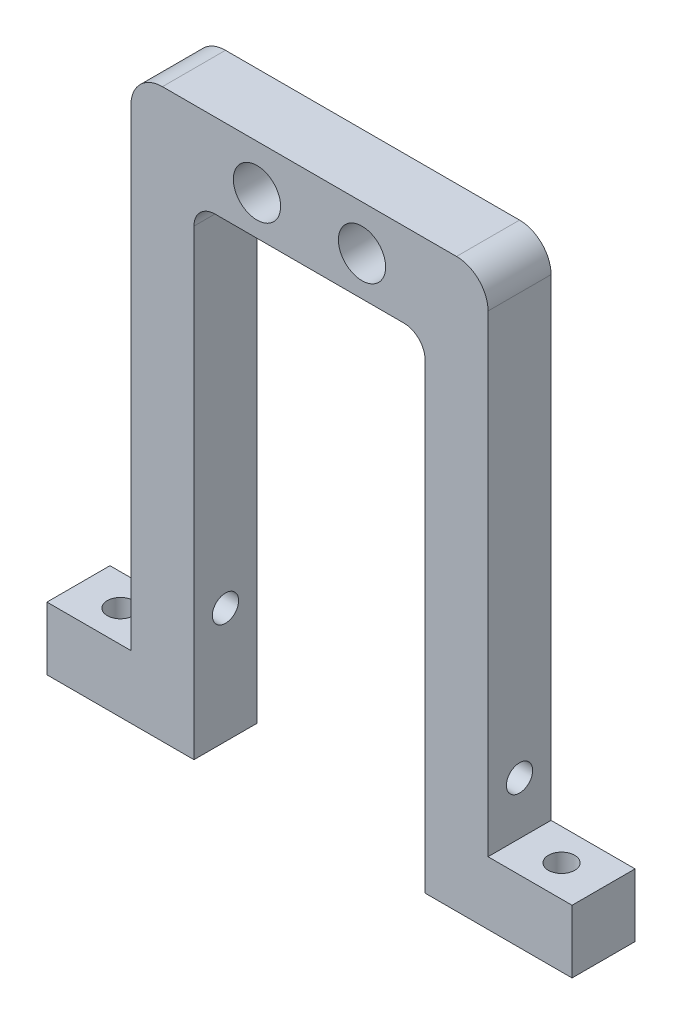
ISO-10303-21;
HEADER;
FILE_DESCRIPTION(('STEP AP214'),'2;1');
FILE_NAME('part.step','',(''),(''),'','','');
FILE_SCHEMA(('AUTOMOTIVE_DESIGN { 1 0 10303 214 1 1 1 1 }'));
ENDSEC;
DATA;
#1=APPLICATION_CONTEXT('core data for automotive mechanical design processes');
#2=APPLICATION_PROTOCOL_DEFINITION('international standard','automotive_design',2000,#1);
#3=PRODUCT_CONTEXT('',#1,'mechanical');
#4=PRODUCT('Part','Part','',(#3));
#5=PRODUCT_RELATED_PRODUCT_CATEGORY('part','',(#4));
#6=PRODUCT_DEFINITION_FORMATION('','',#4);
#7=PRODUCT_DEFINITION_CONTEXT('part definition',#1,'design');
#8=PRODUCT_DEFINITION('design','',#6,#7);
#9=PRODUCT_DEFINITION_SHAPE('','',#8);
#10=(LENGTH_UNIT() NAMED_UNIT(*) SI_UNIT(.MILLI.,.METRE.));
#11=(NAMED_UNIT(*) PLANE_ANGLE_UNIT() SI_UNIT($,.RADIAN.));
#12=(NAMED_UNIT(*) SI_UNIT($,.STERADIAN.) SOLID_ANGLE_UNIT());
#13=UNCERTAINTY_MEASURE_WITH_UNIT(LENGTH_MEASURE(1.E-05),#10,'distance_accuracy_value','');
#14=(GEOMETRIC_REPRESENTATION_CONTEXT(3) GLOBAL_UNCERTAINTY_ASSIGNED_CONTEXT((#13)) GLOBAL_UNIT_ASSIGNED_CONTEXT((#10,
#11,#12)) REPRESENTATION_CONTEXT('',''));
#15=CARTESIAN_POINT('',(0.,0.,0.));
#16=DIRECTION('',(0.,0.,1.));
#17=DIRECTION('',(1.,0.,0.));
#18=AXIS2_PLACEMENT_3D('',#15,#16,#17);
#19=CARTESIAN_POINT('',(17.,-27.,6.));
#20=DIRECTION('',(0.,1.,0.));
#21=DIRECTION('',(-1.,0.,0.));
#22=AXIS2_PLACEMENT_3D('',#19,#20,#21);
#23=PLANE('',#22);
#24=CARTESIAN_POINT('',(21.,-27.,3.));
#25=DIRECTION('',(0.,1.,0.));
#26=DIRECTION('',(-1.,0.,0.));
#27=AXIS2_PLACEMENT_3D('',#24,#25,#26);
#28=CIRCLE('',#27,1.25);
#29=CARTESIAN_POINT('',(19.75,-27.,3.));
#30=VERTEX_POINT('',#29);
#31=EDGE_CURVE('E243',#30,#30,#28,.T.);
#32=ORIENTED_EDGE('',*,*,#31,.T.);
#33=EDGE_LOOP('',(#32));
#34=FACE_BOUND('',#33,.T.);
#35=DIRECTION('',(1.,0.,0.));
#36=VECTOR('',#35,1.);
#37=CARTESIAN_POINT('',(17.,-27.,6.));
#38=LINE('',#37,#36);
#39=CARTESIAN_POINT('',(11.,-27.,6.));
#40=VERTEX_POINT('',#39);
#41=CARTESIAN_POINT('',(25.,-27.,6.));
#42=VERTEX_POINT('',#41);
#43=EDGE_CURVE('E169',#40,#42,#38,.T.);
#44=ORIENTED_EDGE('',*,*,#43,.F.);
#45=DIRECTION('',(0.,0.,-1.));
#46=VECTOR('',#45,1.);
#47=CARTESIAN_POINT('',(11.,-27.,6.));
#48=LINE('',#47,#46);
#49=CARTESIAN_POINT('',(11.,-27.,0.));
#50=VERTEX_POINT('',#49);
#51=EDGE_CURVE('E152',#40,#50,#48,.T.);
#52=ORIENTED_EDGE('',*,*,#51,.T.);
#53=DIRECTION('',(1.,0.,0.));
#54=VECTOR('',#53,1.);
#55=CARTESIAN_POINT('',(17.,-27.,0.));
#56=LINE('',#55,#54);
#57=CARTESIAN_POINT('',(25.,-27.,0.));
#58=VERTEX_POINT('',#57);
#59=EDGE_CURVE('E194',#50,#58,#56,.T.);
#60=ORIENTED_EDGE('',*,*,#59,.T.);
#61=DIRECTION('',(0.,0.,-1.));
#62=VECTOR('',#61,1.);
#63=CARTESIAN_POINT('',(25.,-27.,6.));
#64=LINE('',#63,#62);
#65=EDGE_CURVE('E177',#42,#58,#64,.T.);
#66=ORIENTED_EDGE('',*,*,#65,.F.);
#67=EDGE_LOOP('',(#44,#52,#60,#66));
#68=FACE_BOUND('',#67,.T.);
#69=ADVANCED_FACE('F40',(#34,#68),#23,.F.);
#70=CARTESIAN_POINT('',(-17.,-27.,6.));
#71=DIRECTION('',(1.,0.,0.));
#72=DIRECTION('',(0.,1.,0.));
#73=AXIS2_PLACEMENT_3D('',#70,#71,#72);
#74=PLANE('',#73);
#75=CARTESIAN_POINT('',(-17.,-16.,3.00000000000001));
#76=DIRECTION('',(-1.,0.,0.));
#77=DIRECTION('',(0.,0.,1.));
#78=AXIS2_PLACEMENT_3D('',#75,#76,#77);
#79=CIRCLE('',#78,1.24999999999999);
#80=CARTESIAN_POINT('',(-17.,-16.,4.24999999999999));
#81=VERTEX_POINT('',#80);
#82=EDGE_CURVE('E439',#81,#81,#79,.T.);
#83=ORIENTED_EDGE('',*,*,#82,.F.);
#84=EDGE_LOOP('',(#83));
#85=FACE_BOUND('',#84,.T.);
#86=DIRECTION('',(0.,-1.,0.));
#87=VECTOR('',#86,1.);
#88=CARTESIAN_POINT('',(-17.,-27.,6.));
#89=LINE('',#88,#87);
#90=CARTESIAN_POINT('',(-17.,24.,6.));
#91=VERTEX_POINT('',#90);
#92=CARTESIAN_POINT('',(-17.,-21.,6.));
#93=VERTEX_POINT('',#92);
#94=EDGE_CURVE('E180',#91,#93,#89,.T.);
#95=ORIENTED_EDGE('',*,*,#94,.F.);
#96=DIRECTION('',(0.,0.,-1.));
#97=VECTOR('',#96,1.);
#98=CARTESIAN_POINT('',(-17.,24.,6.));
#99=LINE('',#98,#97);
#100=CARTESIAN_POINT('',(-17.,24.,0.));
#101=VERTEX_POINT('',#100);
#102=EDGE_CURVE('E207',#91,#101,#99,.T.);
#103=ORIENTED_EDGE('',*,*,#102,.T.);
#104=DIRECTION('',(0.,-1.,0.));
#105=VECTOR('',#104,1.);
#106=CARTESIAN_POINT('',(-17.,-27.,0.));
#107=LINE('',#106,#105);
#108=CARTESIAN_POINT('',(-17.,-21.,0.));
#109=VERTEX_POINT('',#108);
#110=EDGE_CURVE('E192',#101,#109,#107,.T.);
#111=ORIENTED_EDGE('',*,*,#110,.T.);
#112=DIRECTION('',(0.,0.,-1.));
#113=VECTOR('',#112,1.);
#114=CARTESIAN_POINT('',(-17.,-21.,6.));
#115=LINE('',#114,#113);
#116=EDGE_CURVE('E255',#93,#109,#115,.T.);
#117=ORIENTED_EDGE('',*,*,#116,.F.);
#118=EDGE_LOOP('',(#95,#103,#111,#117));
#119=FACE_BOUND('',#118,.T.);
#120=ADVANCED_FACE('F318',(#85,#119),#74,.F.);
#121=CARTESIAN_POINT('',(0.,0.,6.));
#122=DIRECTION('',(0.,0.,1.));
#123=DIRECTION('',(1.,0.,0.));
#124=AXIS2_PLACEMENT_3D('',#121,#122,#123);
#125=PLANE('',#124);
#126=DIRECTION('',(-1.,0.,0.));
#127=VECTOR('',#126,1.);
#128=CARTESIAN_POINT('',(17.,27.,6.));
#129=LINE('',#128,#127);
#130=CARTESIAN_POINT('',(14.,27.,6.));
#131=VERTEX_POINT('',#130);
#132=CARTESIAN_POINT('',(-14.,27.,6.));
#133=VERTEX_POINT('',#132);
#134=EDGE_CURVE('E190',#131,#133,#129,.T.);
#135=ORIENTED_EDGE('',*,*,#134,.T.);
#136=CARTESIAN_POINT('',(-14.,24.,6.));
#137=DIRECTION('',(0.,0.,1.));
#138=DIRECTION('',(1.,0.,0.));
#139=AXIS2_PLACEMENT_3D('',#136,#137,#138);
#140=CIRCLE('',#139,3.);
#141=EDGE_CURVE('E221',#133,#91,#140,.T.);
#142=ORIENTED_EDGE('',*,*,#141,.T.);
#143=ORIENTED_EDGE('',*,*,#94,.T.);
#144=DIRECTION('',(-1.,0.,0.));
#145=VECTOR('',#144,1.);
#146=CARTESIAN_POINT('',(-25.,-21.,6.));
#147=LINE('',#146,#145);
#148=CARTESIAN_POINT('',(-25.,-21.,6.));
#149=VERTEX_POINT('',#148);
#150=EDGE_CURVE('E261',#93,#149,#147,.T.);
#151=ORIENTED_EDGE('',*,*,#150,.T.);
#152=DIRECTION('',(0.,-1.,0.));
#153=VECTOR('',#152,1.);
#154=CARTESIAN_POINT('',(-25.,-27.,6.));
#155=LINE('',#154,#153);
#156=CARTESIAN_POINT('',(-25.,-27.,6.));
#157=VERTEX_POINT('',#156);
#158=EDGE_CURVE('E265',#149,#157,#155,.T.);
#159=ORIENTED_EDGE('',*,*,#158,.T.);
#160=CARTESIAN_POINT('',(-11.,-27.,6.));
#161=VERTEX_POINT('',#160);
#162=EDGE_CURVE('E179',#157,#161,#38,.T.);
#163=ORIENTED_EDGE('',*,*,#162,.T.);
#164=DIRECTION('',(0.,-1.,0.));
#165=VECTOR('',#164,1.);
#166=CARTESIAN_POINT('',(-11.,19.,6.));
#167=LINE('',#166,#165);
#168=CARTESIAN_POINT('',(-11.,17.,6.));
#169=VERTEX_POINT('',#168);
#170=EDGE_CURVE('E174',#169,#161,#167,.T.);
#171=ORIENTED_EDGE('',*,*,#170,.F.);
#172=CARTESIAN_POINT('',(-9.,17.,6.));
#173=DIRECTION('',(0.,0.,1.));
#174=DIRECTION('',(1.,0.,0.));
#175=AXIS2_PLACEMENT_3D('',#172,#173,#174);
#176=CIRCLE('',#175,2.);
#177=CARTESIAN_POINT('',(-9.,19.,6.));
#178=VERTEX_POINT('',#177);
#179=EDGE_CURVE('E48',#169,#178,#176,.F.);
#180=ORIENTED_EDGE('',*,*,#179,.T.);
#181=DIRECTION('',(-1.,0.,0.));
#182=VECTOR('',#181,1.);
#183=CARTESIAN_POINT('',(-11.,19.,6.));
#184=LINE('',#183,#182);
#185=CARTESIAN_POINT('',(9.,19.,6.));
#186=VERTEX_POINT('',#185);
#187=EDGE_CURVE('E238',#186,#178,#184,.T.);
#188=ORIENTED_EDGE('',*,*,#187,.F.);
#189=CARTESIAN_POINT('',(9.,17.,6.));
#190=DIRECTION('',(0.,0.,1.));
#191=DIRECTION('',(1.,0.,0.));
#192=AXIS2_PLACEMENT_3D('',#189,#190,#191);
#193=CIRCLE('',#192,2.);
#194=CARTESIAN_POINT('',(11.,17.,6.));
#195=VERTEX_POINT('',#194);
#196=EDGE_CURVE('E172',#186,#195,#193,.F.);
#197=ORIENTED_EDGE('',*,*,#196,.T.);
#198=DIRECTION('',(0.,1.,0.));
#199=VECTOR('',#198,1.);
#200=CARTESIAN_POINT('',(11.,19.,6.));
#201=LINE('',#200,#199);
#202=EDGE_CURVE('E155',#40,#195,#201,.T.);
#203=ORIENTED_EDGE('',*,*,#202,.F.);
#204=ORIENTED_EDGE('',*,*,#43,.T.);
#205=DIRECTION('',(0.,1.,0.));
#206=VECTOR('',#205,1.);
#207=CARTESIAN_POINT('',(25.,-27.,6.));
#208=LINE('',#207,#206);
#209=CARTESIAN_POINT('',(25.,-21.,6.));
#210=VERTEX_POINT('',#209);
#211=EDGE_CURVE('E272',#42,#210,#208,.T.);
#212=ORIENTED_EDGE('',*,*,#211,.T.);
#213=DIRECTION('',(-1.,0.,0.));
#214=VECTOR('',#213,1.);
#215=CARTESIAN_POINT('',(25.,-21.,6.));
#216=LINE('',#215,#214);
#217=CARTESIAN_POINT('',(17.,-21.,6.));
#218=VERTEX_POINT('',#217);
#219=EDGE_CURVE('E274',#210,#218,#216,.T.);
#220=ORIENTED_EDGE('',*,*,#219,.T.);
#221=DIRECTION('',(0.,1.,0.));
#222=VECTOR('',#221,1.);
#223=CARTESIAN_POINT('',(17.,-27.,6.));
#224=LINE('',#223,#222);
#225=CARTESIAN_POINT('',(17.,24.,6.));
#226=VERTEX_POINT('',#225);
#227=EDGE_CURVE('E183',#218,#226,#224,.T.);
#228=ORIENTED_EDGE('',*,*,#227,.T.);
#229=CARTESIAN_POINT('',(14.,24.,6.));
#230=DIRECTION('',(0.,0.,1.));
#231=DIRECTION('',(1.,0.,0.));
#232=AXIS2_PLACEMENT_3D('',#229,#230,#231);
#233=CIRCLE('',#232,3.);
#234=EDGE_CURVE('E219',#226,#131,#233,.T.);
#235=ORIENTED_EDGE('',*,*,#234,.T.);
#236=EDGE_LOOP('',(#135,#142,#143,#151,#159,#163,#171,#180,#188,#197,#203,#204,#212,#220,#228,#235));
#237=FACE_BOUND('',#236,.T.);
#238=CARTESIAN_POINT('',(-5.,22.75,6.));
#239=DIRECTION('',(0.,0.,1.));
#240=DIRECTION('',(1.,0.,0.));
#241=AXIS2_PLACEMENT_3D('',#238,#239,#240);
#242=CIRCLE('',#241,2.25);
#243=CARTESIAN_POINT('',(-2.75,22.75,6.));
#244=VERTEX_POINT('',#243);
#245=EDGE_CURVE('E195',#244,#244,#242,.T.);
#246=ORIENTED_EDGE('',*,*,#245,.F.);
#247=EDGE_LOOP('',(#246));
#248=FACE_BOUND('',#247,.T.);
#249=CARTESIAN_POINT('',(5.,22.75,6.));
#250=DIRECTION('',(0.,0.,1.));
#251=DIRECTION('',(-1.,0.,0.));
#252=AXIS2_PLACEMENT_3D('',#249,#250,#251);
#253=CIRCLE('',#252,2.25);
#254=CARTESIAN_POINT('',(2.75,22.75,6.));
#255=VERTEX_POINT('',#254);
#256=EDGE_CURVE('E287',#255,#255,#253,.T.);
#257=ORIENTED_EDGE('',*,*,#256,.F.);
#258=EDGE_LOOP('',(#257));
#259=FACE_BOUND('',#258,.T.);
#260=ADVANCED_FACE('F167',(#237,#248,#259),#125,.T.);
#261=CARTESIAN_POINT('',(0.,0.,0.));
#262=DIRECTION('',(0.,0.,1.));
#263=DIRECTION('',(1.,0.,0.));
#264=AXIS2_PLACEMENT_3D('',#261,#262,#263);
#265=PLANE('',#264);
#266=ORIENTED_EDGE('',*,*,#110,.F.);
#267=CARTESIAN_POINT('',(-14.,24.,0.));
#268=DIRECTION('',(0.,0.,1.));
#269=DIRECTION('',(1.,0.,0.));
#270=AXIS2_PLACEMENT_3D('',#267,#268,#269);
#271=CIRCLE('',#270,3.);
#272=CARTESIAN_POINT('',(-14.,27.,0.));
#273=VERTEX_POINT('',#272);
#274=EDGE_CURVE('E212',#101,#273,#271,.F.);
#275=ORIENTED_EDGE('',*,*,#274,.T.);
#276=DIRECTION('',(-1.,0.,0.));
#277=VECTOR('',#276,1.);
#278=CARTESIAN_POINT('',(17.,27.,0.));
#279=LINE('',#278,#277);
#280=CARTESIAN_POINT('',(14.,27.,0.));
#281=VERTEX_POINT('',#280);
#282=EDGE_CURVE('E184',#281,#273,#279,.T.);
#283=ORIENTED_EDGE('',*,*,#282,.F.);
#284=CARTESIAN_POINT('',(14.,24.,0.));
#285=DIRECTION('',(0.,0.,1.));
#286=DIRECTION('',(1.,0.,0.));
#287=AXIS2_PLACEMENT_3D('',#284,#285,#286);
#288=CIRCLE('',#287,3.);
#289=CARTESIAN_POINT('',(17.,24.,0.));
#290=VERTEX_POINT('',#289);
#291=EDGE_CURVE('E210',#281,#290,#288,.F.);
#292=ORIENTED_EDGE('',*,*,#291,.T.);
#293=DIRECTION('',(0.,1.,0.));
#294=VECTOR('',#293,1.);
#295=CARTESIAN_POINT('',(17.,-27.,0.));
#296=LINE('',#295,#294);
#297=CARTESIAN_POINT('',(17.,-21.,0.));
#298=VERTEX_POINT('',#297);
#299=EDGE_CURVE('E199',#298,#290,#296,.T.);
#300=ORIENTED_EDGE('',*,*,#299,.F.);
#301=DIRECTION('',(-1.,0.,0.));
#302=VECTOR('',#301,1.);
#303=CARTESIAN_POINT('',(25.,-21.,0.));
#304=LINE('',#303,#302);
#305=CARTESIAN_POINT('',(25.,-21.,0.));
#306=VERTEX_POINT('',#305);
#307=EDGE_CURVE('E275',#306,#298,#304,.T.);
#308=ORIENTED_EDGE('',*,*,#307,.F.);
#309=DIRECTION('',(0.,1.,0.));
#310=VECTOR('',#309,1.);
#311=CARTESIAN_POINT('',(25.,-27.,0.));
#312=LINE('',#311,#310);
#313=EDGE_CURVE('E268',#58,#306,#312,.T.);
#314=ORIENTED_EDGE('',*,*,#313,.F.);
#315=ORIENTED_EDGE('',*,*,#59,.F.);
#316=DIRECTION('',(0.,1.,0.));
#317=VECTOR('',#316,1.);
#318=CARTESIAN_POINT('',(11.,0.,0.));
#319=LINE('',#318,#317);
#320=CARTESIAN_POINT('',(11.,17.,0.));
#321=VERTEX_POINT('',#320);
#322=EDGE_CURVE('E158',#50,#321,#319,.T.);
#323=ORIENTED_EDGE('',*,*,#322,.T.);
#324=CARTESIAN_POINT('',(9.,17.,0.));
#325=DIRECTION('',(0.,0.,1.));
#326=DIRECTION('',(1.,0.,0.));
#327=AXIS2_PLACEMENT_3D('',#324,#325,#326);
#328=CIRCLE('',#327,2.);
#329=CARTESIAN_POINT('',(9.,19.,0.));
#330=VERTEX_POINT('',#329);
#331=EDGE_CURVE('E235',#321,#330,#328,.T.);
#332=ORIENTED_EDGE('',*,*,#331,.T.);
#333=DIRECTION('',(-1.,0.,0.));
#334=VECTOR('',#333,1.);
#335=CARTESIAN_POINT('',(0.,19.,0.));
#336=LINE('',#335,#334);
#337=CARTESIAN_POINT('',(-9.,19.,0.));
#338=VERTEX_POINT('',#337);
#339=EDGE_CURVE('E162',#330,#338,#336,.T.);
#340=ORIENTED_EDGE('',*,*,#339,.T.);
#341=CARTESIAN_POINT('',(-9.,17.,0.));
#342=DIRECTION('',(0.,0.,1.));
#343=DIRECTION('',(1.,0.,0.));
#344=AXIS2_PLACEMENT_3D('',#341,#342,#343);
#345=CIRCLE('',#344,2.);
#346=CARTESIAN_POINT('',(-11.,17.,0.));
#347=VERTEX_POINT('',#346);
#348=EDGE_CURVE('E11',#338,#347,#345,.T.);
#349=ORIENTED_EDGE('',*,*,#348,.T.);
#350=DIRECTION('',(0.,-1.,0.));
#351=VECTOR('',#350,1.);
#352=CARTESIAN_POINT('',(-11.,0.,0.));
#353=LINE('',#352,#351);
#354=CARTESIAN_POINT('',(-11.,-27.,0.));
#355=VERTEX_POINT('',#354);
#356=EDGE_CURVE('E173',#347,#355,#353,.T.);
#357=ORIENTED_EDGE('',*,*,#356,.T.);
#358=CARTESIAN_POINT('',(-25.,-27.,0.));
#359=VERTEX_POINT('',#358);
#360=EDGE_CURVE('E196',#359,#355,#56,.T.);
#361=ORIENTED_EDGE('',*,*,#360,.F.);
#362=DIRECTION('',(0.,-1.,0.));
#363=VECTOR('',#362,1.);
#364=CARTESIAN_POINT('',(-25.,-27.,0.));
#365=LINE('',#364,#363);
#366=CARTESIAN_POINT('',(-25.,-21.,0.));
#367=VERTEX_POINT('',#366);
#368=EDGE_CURVE('E264',#367,#359,#365,.T.);
#369=ORIENTED_EDGE('',*,*,#368,.F.);
#370=DIRECTION('',(-1.,0.,0.));
#371=VECTOR('',#370,1.);
#372=CARTESIAN_POINT('',(-25.,-21.,0.));
#373=LINE('',#372,#371);
#374=EDGE_CURVE('E262',#109,#367,#373,.T.);
#375=ORIENTED_EDGE('',*,*,#374,.F.);
#376=EDGE_LOOP('',(#266,#275,#283,#292,#300,#308,#314,#315,#323,#332,#340,#349,#357,#361,#369,#375));
#377=FACE_BOUND('',#376,.T.);
#378=CARTESIAN_POINT('',(-5.,22.75,0.));
#379=DIRECTION('',(0.,0.,1.));
#380=DIRECTION('',(1.,0.,0.));
#381=AXIS2_PLACEMENT_3D('',#378,#379,#380);
#382=CIRCLE('',#381,2.25);
#383=CARTESIAN_POINT('',(-2.75,22.75,0.));
#384=VERTEX_POINT('',#383);
#385=EDGE_CURVE('E290',#384,#384,#382,.T.);
#386=ORIENTED_EDGE('',*,*,#385,.T.);
#387=EDGE_LOOP('',(#386));
#388=FACE_BOUND('',#387,.T.);
#389=CARTESIAN_POINT('',(5.,22.75,0.));
#390=DIRECTION('',(0.,0.,1.));
#391=DIRECTION('',(-1.,0.,0.));
#392=AXIS2_PLACEMENT_3D('',#389,#390,#391);
#393=CIRCLE('',#392,2.25);
#394=CARTESIAN_POINT('',(2.75,22.75,0.));
#395=VERTEX_POINT('',#394);
#396=EDGE_CURVE('E286',#395,#395,#393,.T.);
#397=ORIENTED_EDGE('',*,*,#396,.T.);
#398=EDGE_LOOP('',(#397));
#399=FACE_BOUND('',#398,.T.);
#400=ADVANCED_FACE('F297',(#377,#388,#399),#265,.F.);
#401=CARTESIAN_POINT('',(-21.,-27.,3.));
#402=DIRECTION('',(0.,1.,0.));
#403=DIRECTION('',(-1.,0.,0.));
#404=AXIS2_PLACEMENT_3D('',#401,#402,#403);
#405=CIRCLE('',#404,1.25);
#406=CARTESIAN_POINT('',(-22.25,-27.,3.));
#407=VERTEX_POINT('',#406);
#408=EDGE_CURVE('E340',#407,#407,#405,.T.);
#409=ORIENTED_EDGE('',*,*,#408,.T.);
#410=EDGE_LOOP('',(#409));
#411=FACE_BOUND('',#410,.T.);
#412=ORIENTED_EDGE('',*,*,#360,.T.);
#413=DIRECTION('',(0.,0.,1.));
#414=VECTOR('',#413,1.);
#415=CARTESIAN_POINT('',(-11.,-27.,6.));
#416=LINE('',#415,#414);
#417=EDGE_CURVE('E163',#355,#161,#416,.T.);
#418=ORIENTED_EDGE('',*,*,#417,.T.);
#419=ORIENTED_EDGE('',*,*,#162,.F.);
#420=DIRECTION('',(0.,0.,-1.));
#421=VECTOR('',#420,1.);
#422=CARTESIAN_POINT('',(-25.,-27.,6.));
#423=LINE('',#422,#421);
#424=EDGE_CURVE('E249',#157,#359,#423,.T.);
#425=ORIENTED_EDGE('',*,*,#424,.T.);
#426=EDGE_LOOP('',(#412,#418,#419,#425));
#427=FACE_BOUND('',#426,.T.);
#428=ADVANCED_FACE('F321',(#411,#427),#23,.F.);
#429=CARTESIAN_POINT('',(17.,-27.,6.));
#430=DIRECTION('',(-1.,0.,0.));
#431=DIRECTION('',(0.,0.,1.));
#432=AXIS2_PLACEMENT_3D('',#429,#430,#431);
#433=PLANE('',#432);
#434=CARTESIAN_POINT('',(17.,-16.,3.00000000000001));
#435=DIRECTION('',(-1.,0.,0.));
#436=DIRECTION('',(0.,0.,1.));
#437=AXIS2_PLACEMENT_3D('',#434,#435,#436);
#438=CIRCLE('',#437,1.24999999999999);
#439=CARTESIAN_POINT('',(17.,-16.,4.24999999999999));
#440=VERTEX_POINT('',#439);
#441=EDGE_CURVE('E421',#440,#440,#438,.T.);
#442=ORIENTED_EDGE('',*,*,#441,.T.);
#443=EDGE_LOOP('',(#442));
#444=FACE_BOUND('',#443,.T.);
#445=ORIENTED_EDGE('',*,*,#299,.T.);
#446=DIRECTION('',(0.,0.,-1.));
#447=VECTOR('',#446,1.);
#448=CARTESIAN_POINT('',(17.,24.,6.));
#449=LINE('',#448,#447);
#450=EDGE_CURVE('E223',#290,#226,#449,.F.);
#451=ORIENTED_EDGE('',*,*,#450,.T.);
#452=ORIENTED_EDGE('',*,*,#227,.F.);
#453=DIRECTION('',(0.,0.,-1.));
#454=VECTOR('',#453,1.);
#455=CARTESIAN_POINT('',(17.,-21.,6.));
#456=LINE('',#455,#454);
#457=EDGE_CURVE('E277',#218,#298,#456,.T.);
#458=ORIENTED_EDGE('',*,*,#457,.T.);
#459=EDGE_LOOP('',(#445,#451,#452,#458));
#460=FACE_BOUND('',#459,.T.);
#461=ADVANCED_FACE('F313',(#444,#460),#433,.F.);
#462=CARTESIAN_POINT('',(17.,27.,6.));
#463=DIRECTION('',(0.,-1.,0.));
#464=DIRECTION('',(1.,0.,0.));
#465=AXIS2_PLACEMENT_3D('',#462,#463,#464);
#466=PLANE('',#465);
#467=ORIENTED_EDGE('',*,*,#282,.T.);
#468=DIRECTION('',(0.,0.,-1.));
#469=VECTOR('',#468,1.);
#470=CARTESIAN_POINT('',(-14.,27.,6.));
#471=LINE('',#470,#469);
#472=EDGE_CURVE('E217',#273,#133,#471,.F.);
#473=ORIENTED_EDGE('',*,*,#472,.T.);
#474=ORIENTED_EDGE('',*,*,#134,.F.);
#475=DIRECTION('',(0.,0.,-1.));
#476=VECTOR('',#475,1.);
#477=CARTESIAN_POINT('',(14.,27.,6.));
#478=LINE('',#477,#476);
#479=EDGE_CURVE('E214',#131,#281,#478,.T.);
#480=ORIENTED_EDGE('',*,*,#479,.T.);
#481=EDGE_LOOP('',(#467,#473,#474,#480));
#482=FACE_BOUND('',#481,.T.);
#483=ADVANCED_FACE('F303',(#482),#466,.F.);
#484=CARTESIAN_POINT('',(-5.,22.75,6.));
#485=DIRECTION('',(0.,0.,-1.));
#486=DIRECTION('',(-1.,0.,0.));
#487=AXIS2_PLACEMENT_3D('',#484,#485,#486);
#488=CYLINDRICAL_SURFACE('',#487,2.25);
#489=ORIENTED_EDGE('',*,*,#245,.T.);
#490=EDGE_LOOP('',(#489));
#491=FACE_BOUND('',#490,.T.);
#492=ORIENTED_EDGE('',*,*,#385,.F.);
#493=EDGE_LOOP('',(#492));
#494=FACE_BOUND('',#493,.T.);
#495=ADVANCED_FACE('F300',(#491,#494),#488,.F.);
#496=CARTESIAN_POINT('',(5.,22.75,6.));
#497=DIRECTION('',(0.,0.,-1.));
#498=DIRECTION('',(-1.,0.,0.));
#499=AXIS2_PLACEMENT_3D('',#496,#497,#498);
#500=CYLINDRICAL_SURFACE('',#499,2.25);
#501=ORIENTED_EDGE('',*,*,#256,.T.);
#502=EDGE_LOOP('',(#501));
#503=FACE_BOUND('',#502,.T.);
#504=ORIENTED_EDGE('',*,*,#396,.F.);
#505=EDGE_LOOP('',(#504));
#506=FACE_BOUND('',#505,.T.);
#507=ADVANCED_FACE('F302',(#503,#506),#500,.F.);
#508=CARTESIAN_POINT('',(25.,-27.,6.));
#509=DIRECTION('',(-1.,0.,0.));
#510=DIRECTION('',(0.,0.,1.));
#511=AXIS2_PLACEMENT_3D('',#508,#509,#510);
#512=PLANE('',#511);
#513=ORIENTED_EDGE('',*,*,#313,.T.);
#514=DIRECTION('',(0.,0.,-1.));
#515=VECTOR('',#514,1.);
#516=CARTESIAN_POINT('',(25.,-21.,6.));
#517=LINE('',#516,#515);
#518=EDGE_CURVE('E282',#210,#306,#517,.T.);
#519=ORIENTED_EDGE('',*,*,#518,.F.);
#520=ORIENTED_EDGE('',*,*,#211,.F.);
#521=ORIENTED_EDGE('',*,*,#65,.T.);
#522=EDGE_LOOP('',(#513,#519,#520,#521));
#523=FACE_BOUND('',#522,.T.);
#524=ADVANCED_FACE('F310',(#523),#512,.F.);
#525=CARTESIAN_POINT('',(25.,-21.,6.));
#526=DIRECTION('',(0.,-1.,0.));
#527=DIRECTION('',(1.,0.,0.));
#528=AXIS2_PLACEMENT_3D('',#525,#526,#527);
#529=PLANE('',#528);
#530=CARTESIAN_POINT('',(21.,-21.,3.));
#531=DIRECTION('',(0.,1.,0.));
#532=DIRECTION('',(0.,0.,1.));
#533=AXIS2_PLACEMENT_3D('',#530,#531,#532);
#534=CIRCLE('',#533,1.25);
#535=CARTESIAN_POINT('',(21.,-21.,4.25));
#536=VERTEX_POINT('',#535);
#537=EDGE_CURVE('E432',#536,#536,#534,.T.);
#538=ORIENTED_EDGE('',*,*,#537,.F.);
#539=EDGE_LOOP('',(#538));
#540=FACE_BOUND('',#539,.T.);
#541=ORIENTED_EDGE('',*,*,#307,.T.);
#542=ORIENTED_EDGE('',*,*,#457,.F.);
#543=ORIENTED_EDGE('',*,*,#219,.F.);
#544=ORIENTED_EDGE('',*,*,#518,.T.);
#545=EDGE_LOOP('',(#541,#542,#543,#544));
#546=FACE_BOUND('',#545,.T.);
#547=ADVANCED_FACE('F374',(#540,#546),#529,.F.);
#548=CARTESIAN_POINT('',(-25.,-27.,6.));
#549=DIRECTION('',(1.,0.,0.));
#550=DIRECTION('',(0.,0.,-1.));
#551=AXIS2_PLACEMENT_3D('',#548,#549,#550);
#552=PLANE('',#551);
#553=ORIENTED_EDGE('',*,*,#368,.T.);
#554=ORIENTED_EDGE('',*,*,#424,.F.);
#555=ORIENTED_EDGE('',*,*,#158,.F.);
#556=DIRECTION('',(0.,0.,-1.));
#557=VECTOR('',#556,1.);
#558=CARTESIAN_POINT('',(-25.,-21.,6.));
#559=LINE('',#558,#557);
#560=EDGE_CURVE('E258',#149,#367,#559,.T.);
#561=ORIENTED_EDGE('',*,*,#560,.T.);
#562=EDGE_LOOP('',(#553,#554,#555,#561));
#563=FACE_BOUND('',#562,.T.);
#564=ADVANCED_FACE('F346',(#563),#552,.F.);
#565=CARTESIAN_POINT('',(-25.,-21.,6.));
#566=DIRECTION('',(0.,-1.,0.));
#567=DIRECTION('',(1.,0.,0.));
#568=AXIS2_PLACEMENT_3D('',#565,#566,#567);
#569=PLANE('',#568);
#570=CARTESIAN_POINT('',(-21.,-21.,3.));
#571=DIRECTION('',(0.,1.,0.));
#572=DIRECTION('',(0.,0.,1.));
#573=AXIS2_PLACEMENT_3D('',#570,#571,#572);
#574=CIRCLE('',#573,1.25);
#575=CARTESIAN_POINT('',(-21.,-21.,4.25));
#576=VERTEX_POINT('',#575);
#577=EDGE_CURVE('E422',#576,#576,#574,.T.);
#578=ORIENTED_EDGE('',*,*,#577,.F.);
#579=EDGE_LOOP('',(#578));
#580=FACE_BOUND('',#579,.T.);
#581=ORIENTED_EDGE('',*,*,#374,.T.);
#582=ORIENTED_EDGE('',*,*,#560,.F.);
#583=ORIENTED_EDGE('',*,*,#150,.F.);
#584=ORIENTED_EDGE('',*,*,#116,.T.);
#585=EDGE_LOOP('',(#581,#582,#583,#584));
#586=FACE_BOUND('',#585,.T.);
#587=ADVANCED_FACE('F351',(#580,#586),#569,.F.);
#588=CARTESIAN_POINT('',(-11.,19.,-4.));
#589=DIRECTION('',(0.,1.,0.));
#590=DIRECTION('',(0.,0.,1.));
#591=AXIS2_PLACEMENT_3D('',#588,#589,#590);
#592=PLANE('',#591);
#593=ORIENTED_EDGE('',*,*,#339,.F.);
#594=DIRECTION('',(0.,0.,1.));
#595=VECTOR('',#594,1.);
#596=CARTESIAN_POINT('',(9.,19.,6.));
#597=LINE('',#596,#595);
#598=EDGE_CURVE('E227',#330,#186,#597,.T.);
#599=ORIENTED_EDGE('',*,*,#598,.T.);
#600=ORIENTED_EDGE('',*,*,#187,.T.);
#601=DIRECTION('',(0.,0.,1.));
#602=VECTOR('',#601,1.);
#603=CARTESIAN_POINT('',(-9.,19.,0.));
#604=LINE('',#603,#602);
#605=EDGE_CURVE('E225',#178,#338,#604,.F.);
#606=ORIENTED_EDGE('',*,*,#605,.T.);
#607=EDGE_LOOP('',(#593,#599,#600,#606));
#608=FACE_BOUND('',#607,.T.);
#609=ADVANCED_FACE('F241',(#608),#592,.F.);
#610=CARTESIAN_POINT('',(11.,19.,-4.));
#611=DIRECTION('',(1.,0.,0.));
#612=DIRECTION('',(0.,1.,0.));
#613=AXIS2_PLACEMENT_3D('',#610,#611,#612);
#614=PLANE('',#613);
#615=CARTESIAN_POINT('',(11.,-16.,3.00000000000001));
#616=DIRECTION('',(1.,0.,0.));
#617=DIRECTION('',(0.,1.,0.));
#618=AXIS2_PLACEMENT_3D('',#615,#616,#617);
#619=CIRCLE('',#618,1.24999999999999);
#620=CARTESIAN_POINT('',(11.,-14.75,3.00000000000001));
#621=VERTEX_POINT('',#620);
#622=EDGE_CURVE('E418',#621,#621,#619,.T.);
#623=ORIENTED_EDGE('',*,*,#622,.T.);
#624=EDGE_LOOP('',(#623));
#625=FACE_BOUND('',#624,.T.);
#626=ORIENTED_EDGE('',*,*,#202,.T.);
#627=DIRECTION('',(0.,0.,1.));
#628=VECTOR('',#627,1.);
#629=CARTESIAN_POINT('',(11.,17.,0.));
#630=LINE('',#629,#628);
#631=EDGE_CURVE('E230',#195,#321,#630,.F.);
#632=ORIENTED_EDGE('',*,*,#631,.T.);
#633=ORIENTED_EDGE('',*,*,#322,.F.);
#634=ORIENTED_EDGE('',*,*,#51,.F.);
#635=EDGE_LOOP('',(#626,#632,#633,#634));
#636=FACE_BOUND('',#635,.T.);
#637=ADVANCED_FACE('F154',(#625,#636),#614,.F.);
#638=CARTESIAN_POINT('',(-11.,19.,-4.));
#639=DIRECTION('',(-1.,0.,0.));
#640=DIRECTION('',(0.,-1.,0.));
#641=AXIS2_PLACEMENT_3D('',#638,#639,#640);
#642=PLANE('',#641);
#643=CARTESIAN_POINT('',(-11.,-16.,3.00000000000001));
#644=DIRECTION('',(-1.,0.,0.));
#645=DIRECTION('',(0.,-1.,0.));
#646=AXIS2_PLACEMENT_3D('',#643,#644,#645);
#647=CIRCLE('',#646,1.24999999999999);
#648=CARTESIAN_POINT('',(-11.,-17.25,3.00000000000001));
#649=VERTEX_POINT('',#648);
#650=EDGE_CURVE('E423',#649,#649,#647,.T.);
#651=ORIENTED_EDGE('',*,*,#650,.T.);
#652=EDGE_LOOP('',(#651));
#653=FACE_BOUND('',#652,.T.);
#654=ORIENTED_EDGE('',*,*,#356,.F.);
#655=DIRECTION('',(0.,0.,1.));
#656=VECTOR('',#655,1.);
#657=CARTESIAN_POINT('',(-11.,17.,6.));
#658=LINE('',#657,#656);
#659=EDGE_CURVE('E232',#347,#169,#658,.T.);
#660=ORIENTED_EDGE('',*,*,#659,.T.);
#661=ORIENTED_EDGE('',*,*,#170,.T.);
#662=ORIENTED_EDGE('',*,*,#417,.F.);
#663=EDGE_LOOP('',(#654,#660,#661,#662));
#664=FACE_BOUND('',#663,.T.);
#665=ADVANCED_FACE('F246',(#653,#664),#642,.F.);
#666=CARTESIAN_POINT('',(-14.,24.,6.));
#667=DIRECTION('',(0.,0.,-1.));
#668=DIRECTION('',(-1.,0.,0.));
#669=AXIS2_PLACEMENT_3D('',#666,#667,#668);
#670=CYLINDRICAL_SURFACE('',#669,3.);
#671=ORIENTED_EDGE('',*,*,#141,.F.);
#672=ORIENTED_EDGE('',*,*,#472,.F.);
#673=ORIENTED_EDGE('',*,*,#274,.F.);
#674=ORIENTED_EDGE('',*,*,#102,.F.);
#675=EDGE_LOOP('',(#671,#672,#673,#674));
#676=FACE_BOUND('',#675,.T.);
#677=ADVANCED_FACE('F362',(#676),#670,.T.);
#678=CARTESIAN_POINT('',(14.,24.,6.));
#679=DIRECTION('',(0.,0.,-1.));
#680=DIRECTION('',(-1.,0.,0.));
#681=AXIS2_PLACEMENT_3D('',#678,#679,#680);
#682=CYLINDRICAL_SURFACE('',#681,3.);
#683=ORIENTED_EDGE('',*,*,#234,.F.);
#684=ORIENTED_EDGE('',*,*,#450,.F.);
#685=ORIENTED_EDGE('',*,*,#291,.F.);
#686=ORIENTED_EDGE('',*,*,#479,.F.);
#687=EDGE_LOOP('',(#683,#684,#685,#686));
#688=FACE_BOUND('',#687,.T.);
#689=ADVANCED_FACE('F365',(#688),#682,.T.);
#690=CARTESIAN_POINT('',(9.,17.,-4.));
#691=DIRECTION('',(0.,0.,-1.));
#692=DIRECTION('',(-1.,0.,0.));
#693=AXIS2_PLACEMENT_3D('',#690,#691,#692);
#694=CYLINDRICAL_SURFACE('',#693,2.);
#695=ORIENTED_EDGE('',*,*,#331,.F.);
#696=ORIENTED_EDGE('',*,*,#631,.F.);
#697=ORIENTED_EDGE('',*,*,#196,.F.);
#698=ORIENTED_EDGE('',*,*,#598,.F.);
#699=EDGE_LOOP('',(#695,#696,#697,#698));
#700=FACE_BOUND('',#699,.T.);
#701=ADVANCED_FACE('F462',(#700),#694,.F.);
#702=CARTESIAN_POINT('',(-9.,17.,-4.));
#703=DIRECTION('',(0.,0.,-1.));
#704=DIRECTION('',(-1.,0.,0.));
#705=AXIS2_PLACEMENT_3D('',#702,#703,#704);
#706=CYLINDRICAL_SURFACE('',#705,2.);
#707=ORIENTED_EDGE('',*,*,#348,.F.);
#708=ORIENTED_EDGE('',*,*,#605,.F.);
#709=ORIENTED_EDGE('',*,*,#179,.F.);
#710=ORIENTED_EDGE('',*,*,#659,.F.);
#711=EDGE_LOOP('',(#707,#708,#709,#710));
#712=FACE_BOUND('',#711,.T.);
#713=ADVANCED_FACE('F42',(#712),#706,.F.);
#714=CARTESIAN_POINT('',(21.,-21.,3.));
#715=DIRECTION('',(0.,1.,0.));
#716=DIRECTION('',(0.,0.,1.));
#717=AXIS2_PLACEMENT_3D('',#714,#715,#716);
#718=CYLINDRICAL_SURFACE('',#717,1.25);
#719=ORIENTED_EDGE('',*,*,#537,.T.);
#720=EDGE_LOOP('',(#719));
#721=FACE_BOUND('',#720,.T.);
#722=ORIENTED_EDGE('',*,*,#31,.F.);
#723=EDGE_LOOP('',(#722));
#724=FACE_BOUND('',#723,.T.);
#725=ADVANCED_FACE('F399',(#721,#724),#718,.F.);
#726=CARTESIAN_POINT('',(-21.,-21.,3.));
#727=DIRECTION('',(0.,1.,0.));
#728=DIRECTION('',(0.,0.,1.));
#729=AXIS2_PLACEMENT_3D('',#726,#727,#728);
#730=CYLINDRICAL_SURFACE('',#729,1.25);
#731=ORIENTED_EDGE('',*,*,#577,.T.);
#732=EDGE_LOOP('',(#731));
#733=FACE_BOUND('',#732,.T.);
#734=ORIENTED_EDGE('',*,*,#408,.F.);
#735=EDGE_LOOP('',(#734));
#736=FACE_BOUND('',#735,.T.);
#737=ADVANCED_FACE('F402',(#733,#736),#730,.F.);
#738=CARTESIAN_POINT('',(-17.,-16.,3.00000000000001));
#739=DIRECTION('',(-1.,0.,0.));
#740=DIRECTION('',(0.,0.,1.));
#741=AXIS2_PLACEMENT_3D('',#738,#739,#740);
#742=CYLINDRICAL_SURFACE('',#741,1.24999999999999);
#743=ORIENTED_EDGE('',*,*,#82,.T.);
#744=EDGE_LOOP('',(#743));
#745=FACE_BOUND('',#744,.T.);
#746=ORIENTED_EDGE('',*,*,#650,.F.);
#747=EDGE_LOOP('',(#746));
#748=FACE_BOUND('',#747,.T.);
#749=ADVANCED_FACE('F406',(#745,#748),#742,.F.);
#750=ORIENTED_EDGE('',*,*,#622,.F.);
#751=EDGE_LOOP('',(#750));
#752=FACE_BOUND('',#751,.T.);
#753=ORIENTED_EDGE('',*,*,#441,.F.);
#754=EDGE_LOOP('',(#753));
#755=FACE_BOUND('',#754,.T.);
#756=ADVANCED_FACE('F408',(#752,#755),#742,.F.);
#757=CLOSED_SHELL('',(#69,#120,#260,#400,#428,#461,#483,#495,#507,#524,#547,#564,#587,#609,#637,
#665,#677,#689,#701,#713,#725,#737,#749,#756));
#758=MANIFOLD_SOLID_BREP('B2',#757);
#759=ADVANCED_BREP_SHAPE_REPRESENTATION('',(#18,#758),#14);
#760=SHAPE_DEFINITION_REPRESENTATION(#9,#759);
ENDSEC;
END-ISO-10303-21;
